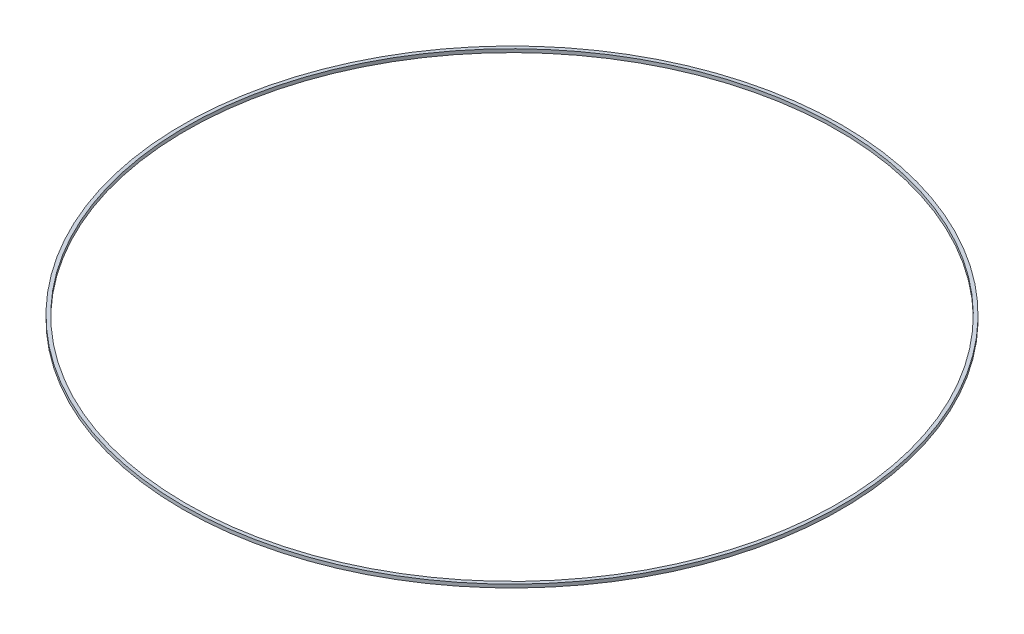
ISO-10303-21;
HEADER;
FILE_DESCRIPTION(('STEP AP214'),'2;1');
FILE_NAME('part.step','',(''),(''),'','','');
FILE_SCHEMA(('AUTOMOTIVE_DESIGN { 1 0 10303 214 1 1 1 1 }'));
ENDSEC;
DATA;
#1=APPLICATION_CONTEXT('core data for automotive mechanical design processes');
#2=APPLICATION_PROTOCOL_DEFINITION('international standard','automotive_design',2000,#1);
#3=PRODUCT_CONTEXT('',#1,'mechanical');
#4=PRODUCT('Part','Part','',(#3));
#5=PRODUCT_RELATED_PRODUCT_CATEGORY('part','',(#4));
#6=PRODUCT_DEFINITION_FORMATION('','',#4);
#7=PRODUCT_DEFINITION_CONTEXT('part definition',#1,'design');
#8=PRODUCT_DEFINITION('design','',#6,#7);
#9=PRODUCT_DEFINITION_SHAPE('','',#8);
#10=(LENGTH_UNIT() NAMED_UNIT(*) SI_UNIT(.MILLI.,.METRE.));
#11=(NAMED_UNIT(*) PLANE_ANGLE_UNIT() SI_UNIT($,.RADIAN.));
#12=(NAMED_UNIT(*) SI_UNIT($,.STERADIAN.) SOLID_ANGLE_UNIT());
#13=UNCERTAINTY_MEASURE_WITH_UNIT(LENGTH_MEASURE(1.E-05),#10,'distance_accuracy_value','');
#14=(GEOMETRIC_REPRESENTATION_CONTEXT(3) GLOBAL_UNCERTAINTY_ASSIGNED_CONTEXT((#13)) GLOBAL_UNIT_ASSIGNED_CONTEXT((#10,
#11,#12)) REPRESENTATION_CONTEXT('',''));
#15=CARTESIAN_POINT('',(0.,0.,0.));
#16=DIRECTION('',(0.,0.,1.));
#17=DIRECTION('',(1.,0.,0.));
#18=AXIS2_PLACEMENT_3D('',#15,#16,#17);
#19=CARTESIAN_POINT('',(0.,1.27,0.));
#20=DIRECTION('',(0.,1.,0.));
#21=DIRECTION('',(0.,0.,1.));
#22=AXIS2_PLACEMENT_3D('',#19,#20,#21);
#23=PLANE('',#22);
#24=CARTESIAN_POINT('',(0.,1.27,0.));
#25=DIRECTION('',(0.,1.,0.));
#26=DIRECTION('',(0.,0.,1.));
#27=AXIS2_PLACEMENT_3D('',#24,#25,#26);
#28=CIRCLE('',#27,124.416473272413);
#29=CARTESIAN_POINT('',(0.,1.27,124.416473272413));
#30=VERTEX_POINT('',#29);
#31=EDGE_CURVE('E10',#30,#30,#28,.T.);
#32=ORIENTED_EDGE('',*,*,#31,.T.);
#33=EDGE_LOOP('',(#32));
#34=FACE_BOUND('',#33,.T.);
#35=CARTESIAN_POINT('',(0.,1.27,0.));
#36=DIRECTION('',(0.,1.,0.));
#37=DIRECTION('',(0.,0.,1.));
#38=AXIS2_PLACEMENT_3D('',#35,#36,#37);
#39=CIRCLE('',#38,123.146473272413);
#40=CARTESIAN_POINT('',(0.,1.27,123.146473272413));
#41=VERTEX_POINT('',#40);
#42=EDGE_CURVE('E40',#41,#41,#39,.T.);
#43=ORIENTED_EDGE('',*,*,#42,.F.);
#44=EDGE_LOOP('',(#43));
#45=FACE_BOUND('',#44,.T.);
#46=ADVANCED_FACE('F29',(#34,#45),#23,.T.);
#47=CARTESIAN_POINT('',(0.,0.,0.));
#48=DIRECTION('',(0.,1.,0.));
#49=DIRECTION('',(0.,0.,1.));
#50=AXIS2_PLACEMENT_3D('',#47,#48,#49);
#51=PLANE('',#50);
#52=CARTESIAN_POINT('',(0.,0.,0.));
#53=DIRECTION('',(0.,1.,0.));
#54=DIRECTION('',(0.,0.,1.));
#55=AXIS2_PLACEMENT_3D('',#52,#53,#54);
#56=CIRCLE('',#55,124.416473272413);
#57=CARTESIAN_POINT('',(0.,0.,124.416473272413));
#58=VERTEX_POINT('',#57);
#59=EDGE_CURVE('E33',#58,#58,#56,.T.);
#60=ORIENTED_EDGE('',*,*,#59,.F.);
#61=EDGE_LOOP('',(#60));
#62=FACE_BOUND('',#61,.T.);
#63=CARTESIAN_POINT('',(0.,0.,0.));
#64=DIRECTION('',(0.,1.,0.));
#65=DIRECTION('',(0.,0.,1.));
#66=AXIS2_PLACEMENT_3D('',#63,#64,#65);
#67=CIRCLE('',#66,123.146473272413);
#68=CARTESIAN_POINT('',(0.,0.,123.146473272413));
#69=VERTEX_POINT('',#68);
#70=EDGE_CURVE('E42',#69,#69,#67,.T.);
#71=ORIENTED_EDGE('',*,*,#70,.T.);
#72=EDGE_LOOP('',(#71));
#73=FACE_BOUND('',#72,.T.);
#74=ADVANCED_FACE('F52',(#62,#73),#51,.F.);
#75=CARTESIAN_POINT('',(0.,1.27,0.));
#76=DIRECTION('',(0.,-1.,0.));
#77=DIRECTION('',(0.,0.,-1.));
#78=AXIS2_PLACEMENT_3D('',#75,#76,#77);
#79=CYLINDRICAL_SURFACE('',#78,124.416473272413);
#80=ORIENTED_EDGE('',*,*,#31,.F.);
#81=EDGE_LOOP('',(#80));
#82=FACE_BOUND('',#81,.T.);
#83=ORIENTED_EDGE('',*,*,#59,.T.);
#84=EDGE_LOOP('',(#83));
#85=FACE_BOUND('',#84,.T.);
#86=ADVANCED_FACE('F31',(#82,#85),#79,.T.);
#87=CARTESIAN_POINT('',(0.,1.27,0.));
#88=DIRECTION('',(0.,-1.,0.));
#89=DIRECTION('',(0.,0.,-1.));
#90=AXIS2_PLACEMENT_3D('',#87,#88,#89);
#91=CYLINDRICAL_SURFACE('',#90,123.146473272413);
#92=ORIENTED_EDGE('',*,*,#42,.T.);
#93=EDGE_LOOP('',(#92));
#94=FACE_BOUND('',#93,.T.);
#95=ORIENTED_EDGE('',*,*,#70,.F.);
#96=EDGE_LOOP('',(#95));
#97=FACE_BOUND('',#96,.T.);
#98=ADVANCED_FACE('F48',(#94,#97),#91,.F.);
#99=CLOSED_SHELL('',(#46,#74,#86,#98));
#100=MANIFOLD_SOLID_BREP('B2',#99);
#101=ADVANCED_BREP_SHAPE_REPRESENTATION('',(#18,#100),#14);
#102=SHAPE_DEFINITION_REPRESENTATION(#9,#101);
ENDSEC;
END-ISO-10303-21;
